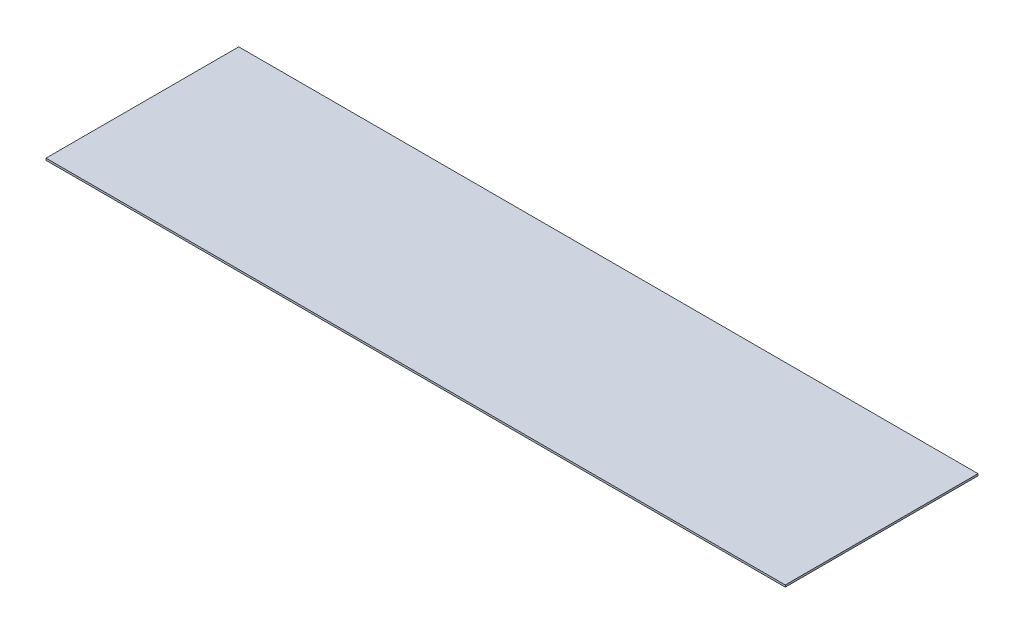
ISO-10303-21;
HEADER;
FILE_DESCRIPTION(('STEP AP214'),'2;1');
FILE_NAME('part.step','',(''),(''),'','','');
FILE_SCHEMA(('AUTOMOTIVE_DESIGN { 1 0 10303 214 1 1 1 1 }'));
ENDSEC;
DATA;
#1=APPLICATION_CONTEXT('core data for automotive mechanical design processes');
#2=APPLICATION_PROTOCOL_DEFINITION('international standard','automotive_design',2000,#1);
#3=PRODUCT_CONTEXT('',#1,'mechanical');
#4=PRODUCT('Part','Part','',(#3));
#5=PRODUCT_RELATED_PRODUCT_CATEGORY('part','',(#4));
#6=PRODUCT_DEFINITION_FORMATION('','',#4);
#7=PRODUCT_DEFINITION_CONTEXT('part definition',#1,'design');
#8=PRODUCT_DEFINITION('design','',#6,#7);
#9=PRODUCT_DEFINITION_SHAPE('','',#8);
#10=(LENGTH_UNIT() NAMED_UNIT(*) SI_UNIT(.MILLI.,.METRE.));
#11=(NAMED_UNIT(*) PLANE_ANGLE_UNIT() SI_UNIT($,.RADIAN.));
#12=(NAMED_UNIT(*) SI_UNIT($,.STERADIAN.) SOLID_ANGLE_UNIT());
#13=UNCERTAINTY_MEASURE_WITH_UNIT(LENGTH_MEASURE(1.E-05),#10,'distance_accuracy_value','');
#14=(GEOMETRIC_REPRESENTATION_CONTEXT(3) GLOBAL_UNCERTAINTY_ASSIGNED_CONTEXT((#13)) GLOBAL_UNIT_ASSIGNED_CONTEXT((#10,
#11,#12)) REPRESENTATION_CONTEXT('',''));
#15=CARTESIAN_POINT('',(0.,0.,0.));
#16=DIRECTION('',(0.,0.,1.));
#17=DIRECTION('',(1.,0.,0.));
#18=AXIS2_PLACEMENT_3D('',#15,#16,#17);
#19=CARTESIAN_POINT('',(0.,3.175,0.));
#20=DIRECTION('',(1.,0.,0.));
#21=DIRECTION('',(0.,0.,-1.));
#22=AXIS2_PLACEMENT_3D('',#19,#20,#21);
#23=PLANE('',#22);
#24=DIRECTION('',(0.,0.,1.));
#25=VECTOR('',#24,1.);
#26=CARTESIAN_POINT('',(0.,0.,0.));
#27=LINE('',#26,#25);
#28=CARTESIAN_POINT('',(0.,0.,-316.23));
#29=VERTEX_POINT('',#28);
#30=CARTESIAN_POINT('',(0.,0.,0.));
#31=VERTEX_POINT('',#30);
#32=EDGE_CURVE('E96',#29,#31,#27,.T.);
#33=ORIENTED_EDGE('',*,*,#32,.T.);
#34=DIRECTION('',(0.,-1.,0.));
#35=VECTOR('',#34,1.);
#36=CARTESIAN_POINT('',(0.,3.175,0.));
#37=LINE('',#36,#35);
#38=CARTESIAN_POINT('',(0.,3.175,0.));
#39=VERTEX_POINT('',#38);
#40=EDGE_CURVE('E11',#39,#31,#37,.T.);
#41=ORIENTED_EDGE('',*,*,#40,.F.);
#42=DIRECTION('',(0.,0.,1.));
#43=VECTOR('',#42,1.);
#44=CARTESIAN_POINT('',(0.,3.175,0.));
#45=LINE('',#44,#43);
#46=CARTESIAN_POINT('',(0.,3.175,-316.23));
#47=VERTEX_POINT('',#46);
#48=EDGE_CURVE('E84',#47,#39,#45,.T.);
#49=ORIENTED_EDGE('',*,*,#48,.F.);
#50=DIRECTION('',(0.,-1.,0.));
#51=VECTOR('',#50,1.);
#52=CARTESIAN_POINT('',(0.,3.175,-316.23));
#53=LINE('',#52,#51);
#54=EDGE_CURVE('E92',#47,#29,#53,.T.);
#55=ORIENTED_EDGE('',*,*,#54,.T.);
#56=EDGE_LOOP('',(#33,#41,#49,#55));
#57=FACE_BOUND('',#56,.T.);
#58=ADVANCED_FACE('F33',(#57),#23,.F.);
#59=CARTESIAN_POINT('',(0.,3.175,0.));
#60=DIRECTION('',(0.,0.,-1.));
#61=DIRECTION('',(-1.,0.,0.));
#62=AXIS2_PLACEMENT_3D('',#59,#60,#61);
#63=PLANE('',#62);
#64=DIRECTION('',(1.,0.,0.));
#65=VECTOR('',#64,1.);
#66=CARTESIAN_POINT('',(0.,0.,0.));
#67=LINE('',#66,#65);
#68=CARTESIAN_POINT('',(1212.85,0.,0.));
#69=VERTEX_POINT('',#68);
#70=EDGE_CURVE('E88',#31,#69,#67,.T.);
#71=ORIENTED_EDGE('',*,*,#70,.T.);
#72=DIRECTION('',(0.,-1.,0.));
#73=VECTOR('',#72,1.);
#74=CARTESIAN_POINT('',(1212.85,3.175,0.));
#75=LINE('',#74,#73);
#76=CARTESIAN_POINT('',(1212.85,3.175,0.));
#77=VERTEX_POINT('',#76);
#78=EDGE_CURVE('E41',#77,#69,#75,.T.);
#79=ORIENTED_EDGE('',*,*,#78,.F.);
#80=DIRECTION('',(1.,0.,0.));
#81=VECTOR('',#80,1.);
#82=CARTESIAN_POINT('',(0.,3.175,0.));
#83=LINE('',#82,#81);
#84=EDGE_CURVE('E79',#39,#77,#83,.T.);
#85=ORIENTED_EDGE('',*,*,#84,.F.);
#86=ORIENTED_EDGE('',*,*,#40,.T.);
#87=EDGE_LOOP('',(#71,#79,#85,#86));
#88=FACE_BOUND('',#87,.T.);
#89=ADVANCED_FACE('F87',(#88),#63,.F.);
#90=CARTESIAN_POINT('',(1212.85,3.175,0.));
#91=DIRECTION('',(-1.,0.,0.));
#92=DIRECTION('',(0.,0.,1.));
#93=AXIS2_PLACEMENT_3D('',#90,#91,#92);
#94=PLANE('',#93);
#95=DIRECTION('',(0.,0.,-1.));
#96=VECTOR('',#95,1.);
#97=CARTESIAN_POINT('',(1212.85,0.,0.));
#98=LINE('',#97,#96);
#99=CARTESIAN_POINT('',(1212.85,0.,-316.23));
#100=VERTEX_POINT('',#99);
#101=EDGE_CURVE('E66',#69,#100,#98,.T.);
#102=ORIENTED_EDGE('',*,*,#101,.T.);
#103=DIRECTION('',(0.,-1.,0.));
#104=VECTOR('',#103,1.);
#105=CARTESIAN_POINT('',(1212.85,3.175,-316.23));
#106=LINE('',#105,#104);
#107=CARTESIAN_POINT('',(1212.85,3.175,-316.23));
#108=VERTEX_POINT('',#107);
#109=EDGE_CURVE('E89',#108,#100,#106,.T.);
#110=ORIENTED_EDGE('',*,*,#109,.F.);
#111=DIRECTION('',(0.,0.,-1.));
#112=VECTOR('',#111,1.);
#113=CARTESIAN_POINT('',(1212.85,3.175,0.));
#114=LINE('',#113,#112);
#115=EDGE_CURVE('E82',#77,#108,#114,.T.);
#116=ORIENTED_EDGE('',*,*,#115,.F.);
#117=ORIENTED_EDGE('',*,*,#78,.T.);
#118=EDGE_LOOP('',(#102,#110,#116,#117));
#119=FACE_BOUND('',#118,.T.);
#120=ADVANCED_FACE('F90',(#119),#94,.F.);
#121=CARTESIAN_POINT('',(0.,3.175,-316.23));
#122=DIRECTION('',(0.,0.,1.));
#123=DIRECTION('',(1.,0.,0.));
#124=AXIS2_PLACEMENT_3D('',#121,#122,#123);
#125=PLANE('',#124);
#126=DIRECTION('',(-1.,0.,0.));
#127=VECTOR('',#126,1.);
#128=CARTESIAN_POINT('',(0.,0.,-316.23));
#129=LINE('',#128,#127);
#130=EDGE_CURVE('E72',#100,#29,#129,.T.);
#131=ORIENTED_EDGE('',*,*,#130,.T.);
#132=ORIENTED_EDGE('',*,*,#54,.F.);
#133=DIRECTION('',(-1.,0.,0.));
#134=VECTOR('',#133,1.);
#135=CARTESIAN_POINT('',(0.,3.175,-316.23));
#136=LINE('',#135,#134);
#137=EDGE_CURVE('E49',#108,#47,#136,.T.);
#138=ORIENTED_EDGE('',*,*,#137,.F.);
#139=ORIENTED_EDGE('',*,*,#109,.T.);
#140=EDGE_LOOP('',(#131,#132,#138,#139));
#141=FACE_BOUND('',#140,.T.);
#142=ADVANCED_FACE('F103',(#141),#125,.F.);
#143=CARTESIAN_POINT('',(0.,3.175,0.));
#144=DIRECTION('',(0.,-1.,0.));
#145=DIRECTION('',(0.,0.,-1.));
#146=AXIS2_PLACEMENT_3D('',#143,#144,#145);
#147=PLANE('',#146);
#148=ORIENTED_EDGE('',*,*,#48,.T.);
#149=ORIENTED_EDGE('',*,*,#84,.T.);
#150=ORIENTED_EDGE('',*,*,#115,.T.);
#151=ORIENTED_EDGE('',*,*,#137,.T.);
#152=EDGE_LOOP('',(#148,#149,#150,#151));
#153=FACE_BOUND('',#152,.T.);
#154=ADVANCED_FACE('F80',(#153),#147,.F.);
#155=CARTESIAN_POINT('',(0.,0.,0.));
#156=DIRECTION('',(0.,-1.,0.));
#157=DIRECTION('',(0.,0.,-1.));
#158=AXIS2_PLACEMENT_3D('',#155,#156,#157);
#159=PLANE('',#158);
#160=ORIENTED_EDGE('',*,*,#32,.F.);
#161=ORIENTED_EDGE('',*,*,#130,.F.);
#162=ORIENTED_EDGE('',*,*,#101,.F.);
#163=ORIENTED_EDGE('',*,*,#70,.F.);
#164=EDGE_LOOP('',(#160,#161,#162,#163));
#165=FACE_BOUND('',#164,.T.);
#166=ADVANCED_FACE('F106',(#165),#159,.T.);
#167=CLOSED_SHELL('',(#58,#89,#120,#142,#154,#166));
#168=MANIFOLD_SOLID_BREP('B2',#167);
#169=ADVANCED_BREP_SHAPE_REPRESENTATION('',(#18,#168),#14);
#170=SHAPE_DEFINITION_REPRESENTATION(#9,#169);
ENDSEC;
END-ISO-10303-21;
